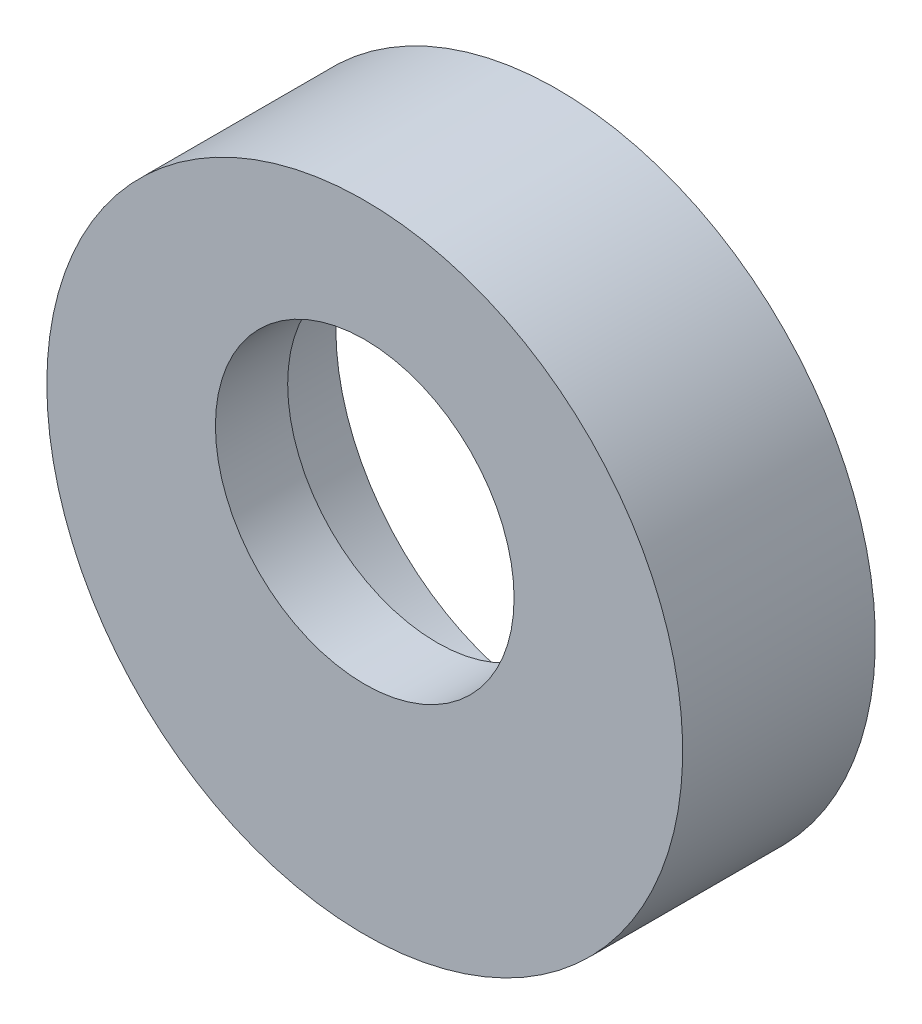
ISO-10303-21;
HEADER;
FILE_DESCRIPTION(('STEP AP214'),'2;1');
FILE_NAME('part.step','',(''),(''),'','','');
FILE_SCHEMA(('AUTOMOTIVE_DESIGN { 1 0 10303 214 1 1 1 1 }'));
ENDSEC;
DATA;
#1=APPLICATION_CONTEXT('core data for automotive mechanical design processes');
#2=APPLICATION_PROTOCOL_DEFINITION('international standard','automotive_design',2000,#1);
#3=PRODUCT_CONTEXT('',#1,'mechanical');
#4=PRODUCT('Part','Part','',(#3));
#5=PRODUCT_RELATED_PRODUCT_CATEGORY('part','',(#4));
#6=PRODUCT_DEFINITION_FORMATION('','',#4);
#7=PRODUCT_DEFINITION_CONTEXT('part definition',#1,'design');
#8=PRODUCT_DEFINITION('design','',#6,#7);
#9=PRODUCT_DEFINITION_SHAPE('','',#8);
#10=(LENGTH_UNIT() NAMED_UNIT(*) SI_UNIT(.MILLI.,.METRE.));
#11=(NAMED_UNIT(*) PLANE_ANGLE_UNIT() SI_UNIT($,.RADIAN.));
#12=(NAMED_UNIT(*) SI_UNIT($,.STERADIAN.) SOLID_ANGLE_UNIT());
#13=UNCERTAINTY_MEASURE_WITH_UNIT(LENGTH_MEASURE(1.E-05),#10,'distance_accuracy_value','');
#14=(GEOMETRIC_REPRESENTATION_CONTEXT(3) GLOBAL_UNCERTAINTY_ASSIGNED_CONTEXT((#13)) GLOBAL_UNIT_ASSIGNED_CONTEXT((#10,
#11,#12)) REPRESENTATION_CONTEXT('',''));
#15=CARTESIAN_POINT('',(0.,0.,0.));
#16=DIRECTION('',(0.,0.,1.));
#17=DIRECTION('',(1.,0.,0.));
#18=AXIS2_PLACEMENT_3D('',#15,#16,#17);
#19=CARTESIAN_POINT('',(-4.6,0.,-4.));
#20=DIRECTION('',(0.,0.,-1.));
#21=DIRECTION('',(-1.,0.,0.));
#22=AXIS2_PLACEMENT_3D('',#19,#20,#21);
#23=PLANE('',#22);
#24=CARTESIAN_POINT('',(0.,0.,-4.));
#25=DIRECTION('',(0.,0.,-1.));
#26=DIRECTION('',(-1.,0.,0.));
#27=AXIS2_PLACEMENT_3D('',#24,#25,#26);
#28=CIRCLE('',#27,6.6);
#29=CARTESIAN_POINT('',(-6.6,0.,-4.));
#30=VERTEX_POINT('',#29);
#31=EDGE_CURVE('E10',#30,#30,#28,.T.);
#32=ORIENTED_EDGE('',*,*,#31,.T.);
#33=EDGE_LOOP('',(#32));
#34=FACE_BOUND('',#33,.T.);
#35=CARTESIAN_POINT('',(0.,0.,-4.));
#36=DIRECTION('',(0.,0.,-1.));
#37=DIRECTION('',(-1.,0.,0.));
#38=AXIS2_PLACEMENT_3D('',#35,#36,#37);
#39=CIRCLE('',#38,4.6);
#40=CARTESIAN_POINT('',(-4.6,0.,-4.));
#41=VERTEX_POINT('',#40);
#42=EDGE_CURVE('E64',#41,#41,#39,.T.);
#43=ORIENTED_EDGE('',*,*,#42,.F.);
#44=EDGE_LOOP('',(#43));
#45=FACE_BOUND('',#44,.T.);
#46=ADVANCED_FACE('F45',(#34,#45),#23,.T.);
#47=CARTESIAN_POINT('',(0.,0.,-55.9602354645795));
#48=DIRECTION('',(0.,0.,-1.));
#49=DIRECTION('',(-1.,0.,0.));
#50=AXIS2_PLACEMENT_3D('',#47,#48,#49);
#51=CYLINDRICAL_SURFACE('',#50,6.6);
#52=CARTESIAN_POINT('',(0.,0.,0.));
#53=DIRECTION('',(0.,0.,-1.));
#54=DIRECTION('',(-1.,0.,0.));
#55=AXIS2_PLACEMENT_3D('',#52,#53,#54);
#56=CIRCLE('',#55,6.6);
#57=CARTESIAN_POINT('',(-6.6,0.,0.));
#58=VERTEX_POINT('',#57);
#59=EDGE_CURVE('E53',#58,#58,#56,.T.);
#60=ORIENTED_EDGE('',*,*,#59,.T.);
#61=EDGE_LOOP('',(#60));
#62=FACE_BOUND('',#61,.T.);
#63=ORIENTED_EDGE('',*,*,#31,.F.);
#64=EDGE_LOOP('',(#63));
#65=FACE_BOUND('',#64,.T.);
#66=ADVANCED_FACE('F97',(#62,#65),#51,.T.);
#67=CARTESIAN_POINT('',(-6.6,0.,0.));
#68=DIRECTION('',(0.,0.,1.));
#69=DIRECTION('',(1.,0.,0.));
#70=AXIS2_PLACEMENT_3D('',#67,#68,#69);
#71=PLANE('',#70);
#72=CARTESIAN_POINT('',(0.,1.,0.));
#73=DIRECTION('',(0.,0.,1.));
#74=DIRECTION('',(1.,0.,0.));
#75=AXIS2_PLACEMENT_3D('',#72,#73,#74);
#76=CIRCLE('',#75,3.1);
#77=CARTESIAN_POINT('',(3.1,1.,0.));
#78=VERTEX_POINT('',#77);
#79=EDGE_CURVE('E68',#78,#78,#76,.T.);
#80=ORIENTED_EDGE('',*,*,#79,.F.);
#81=EDGE_LOOP('',(#80));
#82=FACE_BOUND('',#81,.T.);
#83=ORIENTED_EDGE('',*,*,#59,.F.);
#84=EDGE_LOOP('',(#83));
#85=FACE_BOUND('',#84,.T.);
#86=ADVANCED_FACE('F83',(#82,#85),#71,.T.);
#87=CARTESIAN_POINT('',(0.,0.,-1.5));
#88=DIRECTION('',(0.,0.,-1.));
#89=DIRECTION('',(-1.,0.,0.));
#90=AXIS2_PLACEMENT_3D('',#87,#88,#89);
#91=PLANE('',#90);
#92=CARTESIAN_POINT('',(0.,1.,-1.5));
#93=DIRECTION('',(0.,0.,-1.));
#94=DIRECTION('',(-1.,0.,0.));
#95=AXIS2_PLACEMENT_3D('',#92,#93,#94);
#96=CIRCLE('',#95,3.1);
#97=CARTESIAN_POINT('',(-3.1,1.,-1.5));
#98=VERTEX_POINT('',#97);
#99=EDGE_CURVE('E48',#98,#98,#96,.T.);
#100=ORIENTED_EDGE('',*,*,#99,.F.);
#101=EDGE_LOOP('',(#100));
#102=FACE_BOUND('',#101,.T.);
#103=CARTESIAN_POINT('',(0.,0.,-1.5));
#104=DIRECTION('',(0.,0.,-1.));
#105=DIRECTION('',(-1.,0.,0.));
#106=AXIS2_PLACEMENT_3D('',#103,#104,#105);
#107=CIRCLE('',#106,4.6);
#108=CARTESIAN_POINT('',(-4.6,0.,-1.5));
#109=VERTEX_POINT('',#108);
#110=EDGE_CURVE('E58',#109,#109,#107,.T.);
#111=ORIENTED_EDGE('',*,*,#110,.T.);
#112=EDGE_LOOP('',(#111));
#113=FACE_BOUND('',#112,.T.);
#114=ADVANCED_FACE('F79',(#102,#113),#91,.T.);
#115=CARTESIAN_POINT('',(0.,0.,-55.9602354645795));
#116=DIRECTION('',(0.,0.,-1.));
#117=DIRECTION('',(-1.,0.,0.));
#118=AXIS2_PLACEMENT_3D('',#115,#116,#117);
#119=CYLINDRICAL_SURFACE('',#118,4.6);
#120=ORIENTED_EDGE('',*,*,#42,.T.);
#121=EDGE_LOOP('',(#120));
#122=FACE_BOUND('',#121,.T.);
#123=ORIENTED_EDGE('',*,*,#110,.F.);
#124=EDGE_LOOP('',(#123));
#125=FACE_BOUND('',#124,.T.);
#126=ADVANCED_FACE('F82',(#122,#125),#119,.F.);
#127=CARTESIAN_POINT('',(0.,1.,-4.));
#128=DIRECTION('',(0.,0.,1.));
#129=DIRECTION('',(1.,0.,0.));
#130=AXIS2_PLACEMENT_3D('',#127,#128,#129);
#131=CYLINDRICAL_SURFACE('',#130,3.1);
#132=ORIENTED_EDGE('',*,*,#99,.T.);
#133=EDGE_LOOP('',(#132));
#134=FACE_BOUND('',#133,.T.);
#135=ORIENTED_EDGE('',*,*,#79,.T.);
#136=EDGE_LOOP('',(#135));
#137=FACE_BOUND('',#136,.T.);
#138=ADVANCED_FACE('F77',(#134,#137),#131,.F.);
#139=CLOSED_SHELL('',(#46,#66,#86,#114,#126,#138));
#140=MANIFOLD_SOLID_BREP('B2',#139);
#141=ADVANCED_BREP_SHAPE_REPRESENTATION('',(#18,#140),#14);
#142=SHAPE_DEFINITION_REPRESENTATION(#9,#141);
ENDSEC;
END-ISO-10303-21;
